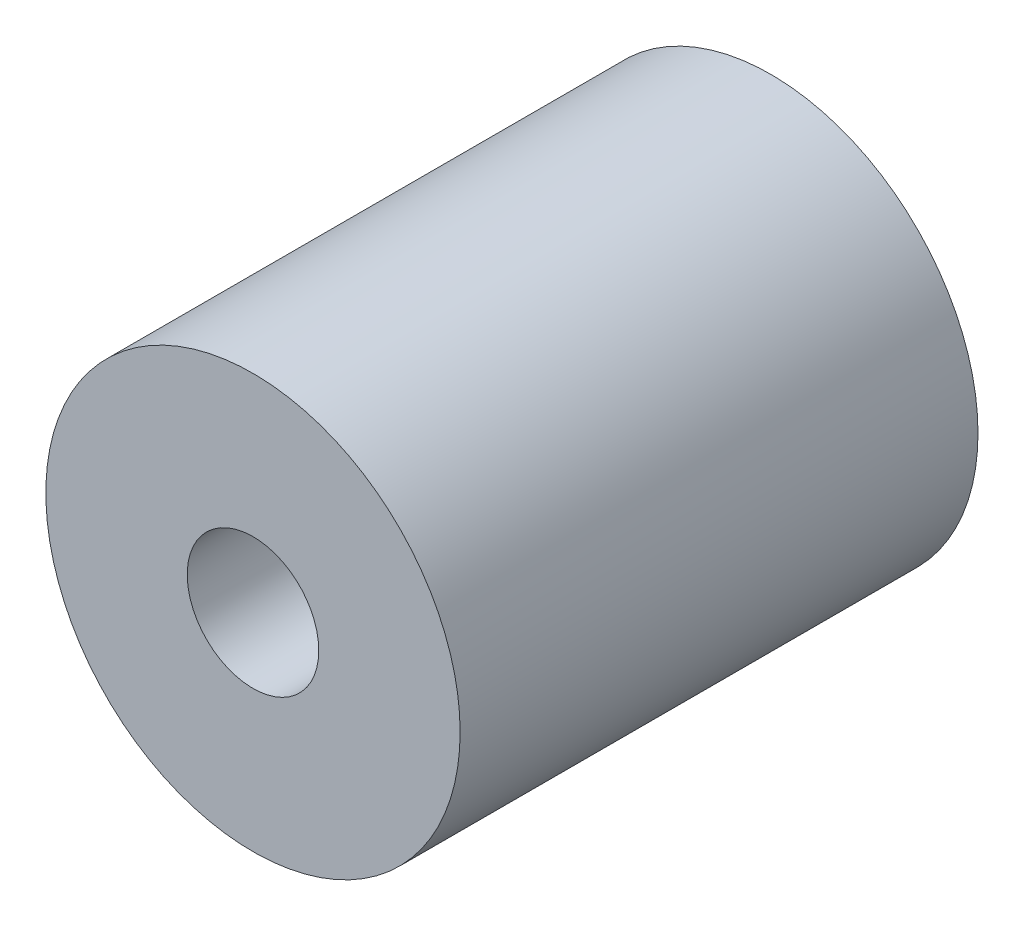
ISO-10303-21;
HEADER;
FILE_DESCRIPTION(('STEP AP214'),'2;1');
FILE_NAME('part.step','',(''),(''),'','','');
FILE_SCHEMA(('AUTOMOTIVE_DESIGN { 1 0 10303 214 1 1 1 1 }'));
ENDSEC;
DATA;
#1=APPLICATION_CONTEXT('core data for automotive mechanical design processes');
#2=APPLICATION_PROTOCOL_DEFINITION('international standard','automotive_design',2000,#1);
#3=PRODUCT_CONTEXT('',#1,'mechanical');
#4=PRODUCT('Part','Part','',(#3));
#5=PRODUCT_RELATED_PRODUCT_CATEGORY('part','',(#4));
#6=PRODUCT_DEFINITION_FORMATION('','',#4);
#7=PRODUCT_DEFINITION_CONTEXT('part definition',#1,'design');
#8=PRODUCT_DEFINITION('design','',#6,#7);
#9=PRODUCT_DEFINITION_SHAPE('','',#8);
#10=(LENGTH_UNIT() NAMED_UNIT(*) SI_UNIT(.MILLI.,.METRE.));
#11=(NAMED_UNIT(*) PLANE_ANGLE_UNIT() SI_UNIT($,.RADIAN.));
#12=(NAMED_UNIT(*) SI_UNIT($,.STERADIAN.) SOLID_ANGLE_UNIT());
#13=UNCERTAINTY_MEASURE_WITH_UNIT(LENGTH_MEASURE(1.E-05),#10,'distance_accuracy_value','');
#14=(GEOMETRIC_REPRESENTATION_CONTEXT(3) GLOBAL_UNCERTAINTY_ASSIGNED_CONTEXT((#13)) GLOBAL_UNIT_ASSIGNED_CONTEXT((#10,
#11,#12)) REPRESENTATION_CONTEXT('',''));
#15=CARTESIAN_POINT('',(0.,0.,0.));
#16=DIRECTION('',(0.,0.,1.));
#17=DIRECTION('',(1.,0.,0.));
#18=AXIS2_PLACEMENT_3D('',#15,#16,#17);
#19=CARTESIAN_POINT('',(0.,0.,25.));
#20=DIRECTION('',(0.,0.,-1.));
#21=DIRECTION('',(-1.,0.,0.));
#22=AXIS2_PLACEMENT_3D('',#19,#20,#21);
#23=CYLINDRICAL_SURFACE('',#22,10.);
#24=CARTESIAN_POINT('',(0.,0.,25.));
#25=DIRECTION('',(0.,0.,1.));
#26=DIRECTION('',(1.,0.,0.));
#27=AXIS2_PLACEMENT_3D('',#24,#25,#26);
#28=CIRCLE('',#27,10.);
#29=CARTESIAN_POINT('',(10.,0.,25.));
#30=VERTEX_POINT('',#29);
#31=EDGE_CURVE('E10',#30,#30,#28,.T.);
#32=ORIENTED_EDGE('',*,*,#31,.F.);
#33=EDGE_LOOP('',(#32));
#34=FACE_BOUND('',#33,.T.);
#35=CARTESIAN_POINT('',(0.,0.,0.));
#36=DIRECTION('',(0.,0.,1.));
#37=DIRECTION('',(1.,0.,0.));
#38=AXIS2_PLACEMENT_3D('',#35,#36,#37);
#39=CIRCLE('',#38,10.);
#40=CARTESIAN_POINT('',(10.,0.,0.));
#41=VERTEX_POINT('',#40);
#42=EDGE_CURVE('E36',#41,#41,#39,.T.);
#43=ORIENTED_EDGE('',*,*,#42,.T.);
#44=EDGE_LOOP('',(#43));
#45=FACE_BOUND('',#44,.T.);
#46=ADVANCED_FACE('F33',(#34,#45),#23,.T.);
#47=CARTESIAN_POINT('',(0.,0.,25.));
#48=DIRECTION('',(0.,0.,1.));
#49=DIRECTION('',(1.,0.,0.));
#50=AXIS2_PLACEMENT_3D('',#47,#48,#49);
#51=PLANE('',#50);
#52=CARTESIAN_POINT('',(0.,0.,25.));
#53=DIRECTION('',(0.,0.,1.));
#54=DIRECTION('',(1.,0.,0.));
#55=AXIS2_PLACEMENT_3D('',#52,#53,#54);
#56=CIRCLE('',#55,3.175);
#57=CARTESIAN_POINT('',(3.175,0.,25.));
#58=VERTEX_POINT('',#57);
#59=EDGE_CURVE('E43',#58,#58,#56,.T.);
#60=ORIENTED_EDGE('',*,*,#59,.F.);
#61=EDGE_LOOP('',(#60));
#62=FACE_BOUND('',#61,.T.);
#63=ORIENTED_EDGE('',*,*,#31,.T.);
#64=EDGE_LOOP('',(#63));
#65=FACE_BOUND('',#64,.T.);
#66=ADVANCED_FACE('F70',(#62,#65),#51,.T.);
#67=CARTESIAN_POINT('',(0.,0.,0.));
#68=DIRECTION('',(0.,0.,1.));
#69=DIRECTION('',(1.,0.,0.));
#70=AXIS2_PLACEMENT_3D('',#67,#68,#69);
#71=PLANE('',#70);
#72=CARTESIAN_POINT('',(0.,0.,0.));
#73=DIRECTION('',(0.,0.,-1.));
#74=DIRECTION('',(-1.,0.,0.));
#75=AXIS2_PLACEMENT_3D('',#72,#73,#74);
#76=CIRCLE('',#75,5.);
#77=CARTESIAN_POINT('',(-5.,0.,0.));
#78=VERTEX_POINT('',#77);
#79=EDGE_CURVE('E51',#78,#78,#76,.T.);
#80=ORIENTED_EDGE('',*,*,#79,.F.);
#81=EDGE_LOOP('',(#80));
#82=FACE_BOUND('',#81,.T.);
#83=ORIENTED_EDGE('',*,*,#42,.F.);
#84=EDGE_LOOP('',(#83));
#85=FACE_BOUND('',#84,.T.);
#86=ADVANCED_FACE('F66',(#82,#85),#71,.F.);
#87=CARTESIAN_POINT('',(0.,0.,12.5));
#88=DIRECTION('',(0.,0.,1.));
#89=DIRECTION('',(1.,0.,0.));
#90=AXIS2_PLACEMENT_3D('',#87,#88,#89);
#91=CYLINDRICAL_SURFACE('',#90,3.175);
#92=CARTESIAN_POINT('',(0.,0.,12.5));
#93=DIRECTION('',(0.,0.,-1.));
#94=DIRECTION('',(-1.,0.,0.));
#95=AXIS2_PLACEMENT_3D('',#92,#93,#94);
#96=CIRCLE('',#95,3.175);
#97=CARTESIAN_POINT('',(-3.175,0.,12.5));
#98=VERTEX_POINT('',#97);
#99=EDGE_CURVE('E47',#98,#98,#96,.F.);
#100=ORIENTED_EDGE('',*,*,#99,.F.);
#101=EDGE_LOOP('',(#100));
#102=FACE_BOUND('',#101,.T.);
#103=ORIENTED_EDGE('',*,*,#59,.T.);
#104=EDGE_LOOP('',(#103));
#105=FACE_BOUND('',#104,.T.);
#106=ADVANCED_FACE('F69',(#102,#105),#91,.F.);
#107=CARTESIAN_POINT('',(0.,0.,12.5));
#108=DIRECTION('',(0.,0.,-1.));
#109=DIRECTION('',(-1.,0.,0.));
#110=AXIS2_PLACEMENT_3D('',#107,#108,#109);
#111=PLANE('',#110);
#112=CARTESIAN_POINT('',(0.,0.,12.5));
#113=DIRECTION('',(0.,0.,-1.));
#114=DIRECTION('',(-1.,0.,0.));
#115=AXIS2_PLACEMENT_3D('',#112,#113,#114);
#116=CIRCLE('',#115,5.);
#117=CARTESIAN_POINT('',(-5.,0.,12.5));
#118=VERTEX_POINT('',#117);
#119=EDGE_CURVE('E50',#118,#118,#116,.T.);
#120=ORIENTED_EDGE('',*,*,#119,.T.);
#121=EDGE_LOOP('',(#120));
#122=FACE_BOUND('',#121,.T.);
#123=ORIENTED_EDGE('',*,*,#99,.T.);
#124=EDGE_LOOP('',(#123));
#125=FACE_BOUND('',#124,.T.);
#126=ADVANCED_FACE('F57',(#122,#125),#111,.T.);
#127=CARTESIAN_POINT('',(0.,0.,12.5));
#128=DIRECTION('',(0.,0.,-1.));
#129=DIRECTION('',(-1.,0.,0.));
#130=AXIS2_PLACEMENT_3D('',#127,#128,#129);
#131=CYLINDRICAL_SURFACE('',#130,5.);
#132=ORIENTED_EDGE('',*,*,#119,.F.);
#133=EDGE_LOOP('',(#132));
#134=FACE_BOUND('',#133,.T.);
#135=ORIENTED_EDGE('',*,*,#79,.T.);
#136=EDGE_LOOP('',(#135));
#137=FACE_BOUND('',#136,.T.);
#138=ADVANCED_FACE('F60',(#134,#137),#131,.F.);
#139=CLOSED_SHELL('',(#46,#66,#86,#106,#126,#138));
#140=MANIFOLD_SOLID_BREP('B2',#139);
#141=ADVANCED_BREP_SHAPE_REPRESENTATION('',(#18,#140),#14);
#142=SHAPE_DEFINITION_REPRESENTATION(#9,#141);
ENDSEC;
END-ISO-10303-21;
